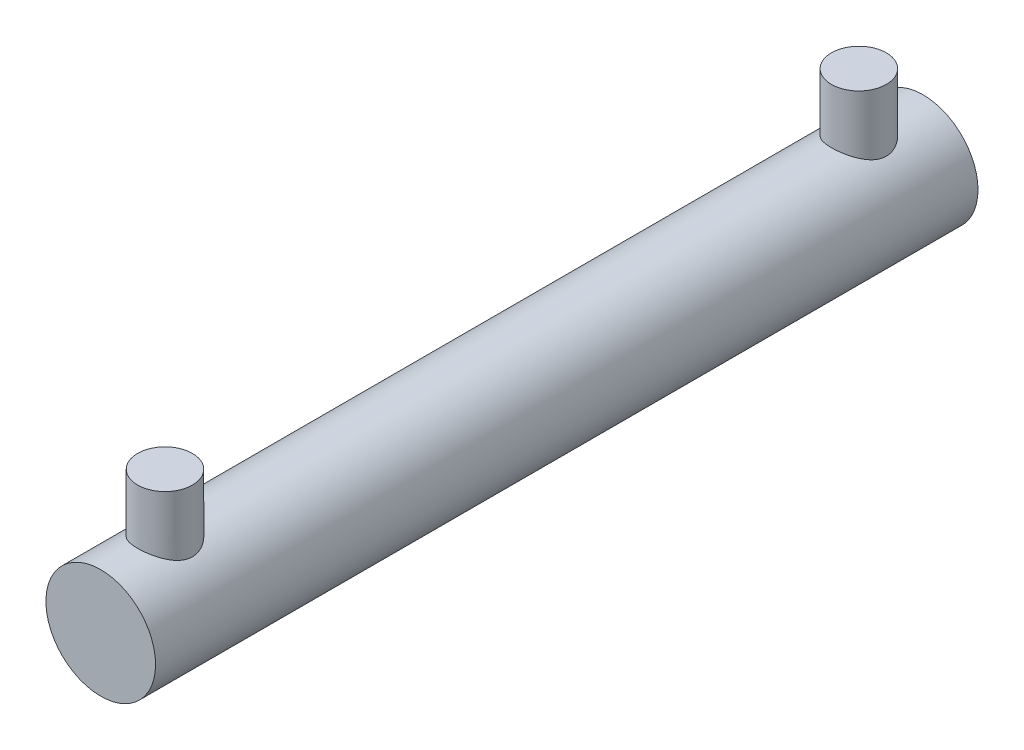
ISO-10303-21;
HEADER;
FILE_DESCRIPTION(('STEP AP214'),'2;1');
FILE_NAME('part.step','',(''),(''),'','','');
FILE_SCHEMA(('AUTOMOTIVE_DESIGN { 1 0 10303 214 1 1 1 1 }'));
ENDSEC;
DATA;
#1=APPLICATION_CONTEXT('core data for automotive mechanical design processes');
#2=APPLICATION_PROTOCOL_DEFINITION('international standard','automotive_design',2000,#1);
#3=PRODUCT_CONTEXT('',#1,'mechanical');
#4=PRODUCT('Part','Part','',(#3));
#5=PRODUCT_RELATED_PRODUCT_CATEGORY('part','',(#4));
#6=PRODUCT_DEFINITION_FORMATION('','',#4);
#7=PRODUCT_DEFINITION_CONTEXT('part definition',#1,'design');
#8=PRODUCT_DEFINITION('design','',#6,#7);
#9=PRODUCT_DEFINITION_SHAPE('','',#8);
#10=(LENGTH_UNIT() NAMED_UNIT(*) SI_UNIT(.MILLI.,.METRE.));
#11=(NAMED_UNIT(*) PLANE_ANGLE_UNIT() SI_UNIT($,.RADIAN.));
#12=(NAMED_UNIT(*) SI_UNIT($,.STERADIAN.) SOLID_ANGLE_UNIT());
#13=UNCERTAINTY_MEASURE_WITH_UNIT(LENGTH_MEASURE(1.E-05),#10,'distance_accuracy_value','');
#14=(GEOMETRIC_REPRESENTATION_CONTEXT(3) GLOBAL_UNCERTAINTY_ASSIGNED_CONTEXT((#13)) GLOBAL_UNIT_ASSIGNED_CONTEXT((#10,
#11,#12)) REPRESENTATION_CONTEXT('',''));
#15=CARTESIAN_POINT('',(0.,0.,0.));
#16=DIRECTION('',(0.,0.,1.));
#17=DIRECTION('',(1.,0.,0.));
#18=AXIS2_PLACEMENT_3D('',#15,#16,#17);
#19=CARTESIAN_POINT('',(0.,0.,150.));
#20=DIRECTION('',(0.,0.,-1.));
#21=DIRECTION('',(-1.,0.,0.));
#22=AXIS2_PLACEMENT_3D('',#19,#20,#21);
#23=CYLINDRICAL_SURFACE('',#22,20.);
#24=CARTESIAN_POINT('',(0.,0.,150.));
#25=DIRECTION('',(0.,0.,1.));
#26=DIRECTION('',(1.,0.,0.));
#27=AXIS2_PLACEMENT_3D('',#24,#25,#26);
#28=CIRCLE('',#27,20.);
#29=CARTESIAN_POINT('',(20.,0.,150.));
#30=VERTEX_POINT('',#29);
#31=EDGE_CURVE('E47',#30,#30,#28,.T.);
#32=ORIENTED_EDGE('',*,*,#31,.F.);
#33=EDGE_LOOP('',(#32));
#34=FACE_BOUND('',#33,.T.);
#35=CARTESIAN_POINT('',(0.,0.,-150.));
#36=DIRECTION('',(0.,0.,1.));
#37=DIRECTION('',(1.,0.,0.));
#38=AXIS2_PLACEMENT_3D('',#35,#36,#37);
#39=CIRCLE('',#38,20.);
#40=CARTESIAN_POINT('',(20.,0.,-150.));
#41=VERTEX_POINT('',#40);
#42=EDGE_CURVE('E51',#41,#41,#39,.T.);
#43=ORIENTED_EDGE('',*,*,#42,.T.);
#44=EDGE_LOOP('',(#43));
#45=FACE_BOUND('',#44,.T.);
#46=CARTESIAN_POINT('',(0.,20.,-136.551526585557));
#47=CARTESIAN_POINT('',(-0.262977747570469,19.9999992010162,-136.551525716711));
#48=CARTESIAN_POINT('',(-0.525973881907788,19.9948010837,-136.541141071612));
#49=CARTESIAN_POINT('',(-1.0500292311712,19.9741395354228,-136.499720760697));
#50=CARTESIAN_POINT('',(-1.31108755349614,19.9586716387275,-136.468676111024));
#51=CARTESIAN_POINT('',(-1.82963226043826,19.9178362229901,-136.386234675155));
#52=CARTESIAN_POINT('',(-2.08711188872545,19.8924520749392,-136.334803700075));
#53=CARTESIAN_POINT('',(-2.59618182802919,19.8324363448083,-136.212188371427));
#54=CARTESIAN_POINT('',(-2.847772725312,19.7978056875818,-136.141005993406));
#55=CARTESIAN_POINT('',(-3.3424683682257,19.720303023444,-135.979957583385));
#56=CARTESIAN_POINT('',(-3.58560245696296,19.6774637808779,-135.890165718101));
#57=CARTESIAN_POINT('',(-4.06298432085465,19.5844658749963,-135.692582263873));
#58=CARTESIAN_POINT('',(-4.29723190454894,19.5343070540929,-135.584790287385));
#59=CARTESIAN_POINT('',(-4.75551398861711,19.4278257394007,-135.352157349032));
#60=CARTESIAN_POINT('',(-4.97955221985718,19.371505523214,-135.227322682912));
#61=CARTESIAN_POINT('',(-5.41653080360957,19.2538936046229,-134.961439656538));
#62=CARTESIAN_POINT('',(-5.62946673237805,19.1925999450287,-134.820384904026));
#63=CARTESIAN_POINT('',(-6.05571153636931,19.0625536763854,-134.514022022171));
#64=CARTESIAN_POINT('',(-6.26826892607331,18.9935741626949,-134.347764382137));
#65=CARTESIAN_POINT('',(-6.67880739057354,18.8531326273725,-133.999081455242));
#66=CARTESIAN_POINT('',(-6.8767876309065,18.7816704639663,-133.816655244132));
#67=CARTESIAN_POINT('',(-7.25738906236846,18.6379106306311,-133.436488005887));
#68=CARTESIAN_POINT('',(-7.44000060064987,18.5656124675679,-133.238737501351));
#69=CARTESIAN_POINT('',(-7.7888836174931,18.4219676840917,-132.828924629332));
#70=CARTESIAN_POINT('',(-7.95515202519228,18.3506212446753,-132.616859584735));
#71=CARTESIAN_POINT('',(-8.28271110573771,18.2052535437119,-132.162333386936));
#72=CARTESIAN_POINT('',(-8.44260565220418,18.1314567024133,-131.918791221173));
#73=CARTESIAN_POINT('',(-8.74109142208521,17.9894590508883,-131.417568105724));
#74=CARTESIAN_POINT('',(-8.87969167215243,17.9212558752544,-131.15989321011));
#75=CARTESIAN_POINT('',(-9.13438777848808,17.7927881626278,-130.631827382426));
#76=CARTESIAN_POINT('',(-9.25049044721744,17.7325212242509,-130.361440330618));
#77=CARTESIAN_POINT('',(-9.45894522420919,17.6222099564148,-129.809640632107));
#78=CARTESIAN_POINT('',(-9.55129996419766,17.5721644943465,-129.528229211101));
#79=CARTESIAN_POINT('',(-9.70625458779874,17.4870229092242,-128.973611545497));
#80=CARTESIAN_POINT('',(-9.77030307761469,17.4512120054423,-128.700920330777));
#81=CARTESIAN_POINT('',(-9.87543221046261,17.3919377517219,-128.149810120021));
#82=CARTESIAN_POINT('',(-9.91651383598184,17.368473873599,-127.871391369529));
#83=CARTESIAN_POINT('',(-9.97504777353869,17.3349233192211,-127.31151198637));
#84=CARTESIAN_POINT('',(-9.99252007209236,17.3248253281998,-127.03005413021));
#85=CARTESIAN_POINT('',(-10.0036080043825,17.3184259915651,-126.46652407572));
#86=CARTESIAN_POINT('',(-9.99722591425208,17.3221233296318,-126.18445193857));
#87=CARTESIAN_POINT('',(-9.96291632672931,17.3418743842694,-125.656121787653));
#88=CARTESIAN_POINT('',(-9.93766509151721,17.3563927185974,-125.409626414199));
#89=CARTESIAN_POINT('',(-9.8690882825972,17.3954780340008,-124.919887361261));
#90=CARTESIAN_POINT('',(-9.82575672853391,17.4200483398744,-124.676644785192));
#91=CARTESIAN_POINT('',(-9.72152759312325,17.4784283554102,-124.195134860528));
#92=CARTESIAN_POINT('',(-9.66063238238804,17.5122368181421,-123.956866845153));
#93=CARTESIAN_POINT('',(-9.5218798945916,17.5880654989193,-123.486573021322));
#94=CARTESIAN_POINT('',(-9.44401584795466,17.6300889935922,-123.254549745775));
#95=CARTESIAN_POINT('',(-9.27007793534025,17.7221768246774,-122.792815994029));
#96=CARTESIAN_POINT('',(-9.17362860412847,17.7724029635355,-122.56327953229));
#97=CARTESIAN_POINT('',(-8.96447979140212,17.878810533816,-122.11308841606));
#98=CARTESIAN_POINT('',(-8.85177491107831,17.9349939421242,-121.892436743663));
#99=CARTESIAN_POINT('',(-8.61087933619458,18.0518884826287,-121.460964810941));
#100=CARTESIAN_POINT('',(-8.48268586368169,18.1126004262899,-121.250146323672));
#101=CARTESIAN_POINT('',(-8.21155546672611,18.2371218065418,-120.839174219348));
#102=CARTESIAN_POINT('',(-8.06861764351119,18.3009314318325,-120.639021253562));
#103=CARTESIAN_POINT('',(-7.74962298190964,18.4384710076206,-120.225394905574));
#104=CARTESIAN_POINT('',(-7.57166567582239,18.5124312542501,-120.013460482218));
#105=CARTESIAN_POINT('',(-7.19890817206694,18.6605447929763,-119.605151721394));
#106=CARTESIAN_POINT('',(-7.00411219662652,18.7346980321841,-119.408773506802));
#107=CARTESIAN_POINT('',(-6.59841324594339,18.8814062531242,-119.032380004797));
#108=CARTESIAN_POINT('',(-6.38749704374534,18.9539598580541,-118.8523784258));
#109=CARTESIAN_POINT('',(-5.95079617043248,19.0955673475655,-118.510073722054));
#110=CARTESIAN_POINT('',(-5.7250174107728,19.164622604476,-118.347763628077));
#111=CARTESIAN_POINT('',(-5.24872768197161,19.3006480329725,-118.034730720068));
#112=CARTESIAN_POINT('',(-4.9975537482717,19.3673693587667,-117.884905739585));
#113=CARTESIAN_POINT('',(-4.48152997851448,19.4932401539485,-117.607157348626));
#114=CARTESIAN_POINT('',(-4.2166795063401,19.5523892706948,-117.479234958071));
#115=CARTESIAN_POINT('',(-3.67526022803787,19.6613492326779,-117.246732282094));
#116=CARTESIAN_POINT('',(-3.39869900661395,19.7111660121174,-117.142137155324));
#117=CARTESIAN_POINT('',(-2.83582264507485,19.7999810198758,-116.957475806685));
#118=CARTESIAN_POINT('',(-2.54950863124166,19.8389804926862,-116.877406763068));
#119=CARTESIAN_POINT('',(-1.9936008207671,19.9021913169255,-116.748460724398));
#120=CARTESIAN_POINT('',(-1.72458658463507,19.9273600412885,-116.697549342596));
#121=CARTESIAN_POINT('',(-1.18250594424723,19.9668602547768,-116.617911427464));
#122=CARTESIAN_POINT('',(-0.909439761223912,19.9811923333691,-116.589183687437));
#123=CARTESIAN_POINT('',(-0.36162145206137,19.9986076087938,-116.554300264774));
#124=CARTESIAN_POINT('',(-0.0868700440476367,20.0016953032259,-116.548135557229));
#125=CARTESIAN_POINT('',(0.462095284936308,19.996544733302,-116.558437773187));
#126=CARTESIAN_POINT('',(0.736309229155645,19.9883069701865,-116.574903695106));
#127=CARTESIAN_POINT('',(1.26069578442055,19.9618171280824,-116.628088647255));
#128=CARTESIAN_POINT('',(1.51108216427542,19.9443921243345,-116.663136158377));
#129=CARTESIAN_POINT('',(2.00770334634759,19.9005341339856,-116.751896580736));
#130=CARTESIAN_POINT('',(2.25393841461836,19.8741017269811,-116.805608290997));
#131=CARTESIAN_POINT('',(2.7406844611906,19.812845023159,-116.931140577652));
#132=CARTESIAN_POINT('',(2.98119512032807,19.7780202596251,-117.002962161184));
#133=CARTESIAN_POINT('',(3.4550508210735,19.7007681992834,-117.16402124393));
#134=CARTESIAN_POINT('',(3.68839556112771,19.6583405830473,-117.253259474905));
#135=CARTESIAN_POINT('',(4.15316088617015,19.5655046555384,-117.451151309876));
#136=CARTESIAN_POINT('',(4.38433936906094,19.5149041886911,-117.560283624391));
#137=CARTESIAN_POINT('',(4.83663774643759,19.4077573479828,-117.79527448192));
#138=CARTESIAN_POINT('',(5.05775400766403,19.3512088504371,-117.921139003261));
#139=CARTESIAN_POINT('',(5.70436813169988,19.1744474473865,-118.322470072004));
#140=CARTESIAN_POINT('',(6.1133785844896,19.0470672570173,-118.621780253218));
#141=CARTESIAN_POINT('',(6.91779518371266,18.7707873202954,-119.309227127247));
#142=CARTESIAN_POINT('',(7.30792110762596,18.6210027147805,-119.703200293549));
#143=CARTESIAN_POINT('',(7.84082560671493,18.3999640224111,-120.338787144147));
#144=CARTESIAN_POINT('',(8.00984942409513,18.3268393772916,-120.558261799021));
#145=CARTESIAN_POINT('',(8.32960568094729,18.183737266458,-121.011266028321));
#146=CARTESIAN_POINT('',(8.4803354830786,18.1137602554328,-121.244797622011));
#147=CARTESIAN_POINT('',(8.76928163027867,17.9757225676596,-121.7364525794));
#148=CARTESIAN_POINT('',(8.90652817819507,17.9079221139821,-121.995219892309));
#149=CARTESIAN_POINT('',(9.15837639012035,17.7804404562871,-122.525338130109));
#150=CARTESIAN_POINT('',(9.27298894306127,17.7207553524022,-122.79668292617));
#151=CARTESIAN_POINT('',(9.47827705930681,17.6118078617936,-123.350076448856));
#152=CARTESIAN_POINT('',(9.56897185129601,17.5625371088176,-123.63211636718));
#153=CARTESIAN_POINT('',(9.72530086409336,17.4764560330943,-124.204909800908));
#154=CARTESIAN_POINT('',(9.79093896514153,17.4396437811433,-124.495661959623));
#155=CARTESIAN_POINT('',(9.89107565144743,17.3830260812378,-125.055051382276));
#156=CARTESIAN_POINT('',(9.92795857968717,17.3619273114046,-125.323132340229));
#157=CARTESIAN_POINT('',(9.97987692141646,17.332136815937,-125.862087244858));
#158=CARTESIAN_POINT('',(9.99491382071395,17.3234442465237,-126.132961000324));
#159=CARTESIAN_POINT('',(10.0029096686844,17.3188284226879,-126.675040154455));
#160=CARTESIAN_POINT('',(9.9958767833924,17.3229004452416,-126.946245393347));
#161=CARTESIAN_POINT('',(9.95985898725887,17.3436339919872,-127.486698695321));
#162=CARTESIAN_POINT('',(9.93087497508662,17.3602950007916,-127.75594683807));
#163=CARTESIAN_POINT('',(9.85519722920277,17.4033551463061,-128.26464103095));
#164=CARTESIAN_POINT('',(9.81046230963215,17.4286705637748,-128.504474594482));
#165=CARTESIAN_POINT('',(9.70388285528389,17.4882355534742,-128.979255783384));
#166=CARTESIAN_POINT('',(9.64203265928581,17.5224880816187,-129.214201764393));
#167=CARTESIAN_POINT('',(9.50186064219783,17.5988921487312,-129.67775020196));
#168=CARTESIAN_POINT('',(9.42354151869526,17.6410423939411,-129.906353690475));
#169=CARTESIAN_POINT('',(9.25107208633865,17.7320944008379,-130.356225073901));
#170=CARTESIAN_POINT('',(9.15691467555994,17.7809991895098,-130.577489624492));
#171=CARTESIAN_POINT('',(8.94668289722952,17.8877520145129,-131.02615247768));
#172=CARTESIAN_POINT('',(8.82956366921283,17.9459794825375,-131.252970764157));
#173=CARTESIAN_POINT('',(8.57895403368728,18.067122458149,-131.696072016429));
#174=CARTESIAN_POINT('',(8.44546216273868,18.130038384608,-131.912354038041));
#175=CARTESIAN_POINT('',(8.16285657798004,18.2590224525038,-132.333577962916));
#176=CARTESIAN_POINT('',(8.01373739051541,18.3250916939848,-132.538515854095));
#177=CARTESIAN_POINT('',(7.70065351710478,18.4588439084551,-132.936195185127));
#178=CARTESIAN_POINT('',(7.53668670721057,18.5265271112979,-133.12893487331));
#179=CARTESIAN_POINT('',(7.17380336462424,18.6702735648096,-133.524115656427));
#180=CARTESIAN_POINT('',(6.97306234663123,18.746353564782,-133.724879760119));
#181=CARTESIAN_POINT('',(6.55492133587247,18.8966226391637,-134.108877993293));
#182=CARTESIAN_POINT('',(6.33752607360946,18.9708122426046,-134.292117067611));
#183=CARTESIAN_POINT('',(5.88693376044407,19.1154396310611,-134.640104805661));
#184=CARTESIAN_POINT('',(5.65372458790795,19.1858744624017,-134.8048390222));
#185=CARTESIAN_POINT('',(5.17289544211031,19.3210638569054,-135.114405713197));
#186=CARTESIAN_POINT('',(4.9252763003718,19.3858187472881,-135.259239334397));
#187=CARTESIAN_POINT('',(4.41518835199795,19.5083417849818,-135.528714863554));
#188=CARTESIAN_POINT('',(4.15262447046933,19.5660555714726,-135.653201915895));
#189=CARTESIAN_POINT('',(3.61607511779453,19.6722841833782,-135.879373948781));
#190=CARTESIAN_POINT('',(3.34209105214396,19.7208001367275,-135.981061725492));
#191=CARTESIAN_POINT('',(2.78539452130532,19.8070877528213,-136.160214078864));
#192=CARTESIAN_POINT('',(2.50270444198693,19.8448847753657,-136.237735873452));
#193=CARTESIAN_POINT('',(1.93047321727417,19.908692874149,-136.367802675625));
#194=CARTESIAN_POINT('',(1.64093637072212,19.9347111494098,-136.420362940349));
#195=CARTESIAN_POINT('',(1.12608352412094,19.9695276660452,-136.490475489065));
#196=CARTESIAN_POINT('',(0.90165168027671,19.9809348086311,-136.513350051871));
#197=CARTESIAN_POINT('',(0.451484431282411,19.9961714231232,-136.543876183128));
#198=CARTESIAN_POINT('',(0.225748990324603,20.0000006858747,-136.551527331403));
#199=CARTESIAN_POINT('',(0.,20.,-136.551526585557));
#200=B_SPLINE_CURVE_WITH_KNOTS('',3,(#46,#47,#48,#49,#50,#51,#52,#53,#54,#55,#56,#57,#58,#59,
#60,#61,#62,#63,#64,#65,#66,#67,#68,#69,#70,#71,#72,#73,#74,#75,#76,#77,#78,#79,#80,#81,#82,#83,
#84,#85,#86,#87,#88,#89,#90,#91,#92,#93,#94,#95,#96,#97,#98,#99,#100,#101,#102,#103,#104,#105,
#106,#107,#108,#109,#110,#111,#112,#113,#114,#115,#116,#117,#118,#119,#120,#121,#122,#123,#124,
#125,#126,#127,#128,#129,#130,#131,#132,#133,#134,#135,#136,#137,#138,#139,#140,#141,#142,#143,
#144,#145,#146,#147,#148,#149,#150,#151,#152,#153,#154,#155,#156,#157,#158,#159,#160,#161,#162,
#163,#164,#165,#166,#167,#168,#169,#170,#171,#172,#173,#174,#175,#176,#177,#178,#179,#180,#181,
#182,#183,#184,#185,#186,#187,#188,#189,#190,#191,#192,#193,#194,#195,#196,#197,#198,#199),
.UNSPECIFIED.,.T.,.F.,(4,2,2,2,2,2,2,2,2,2,2,2,2,2,2,2,2,2,2,2,2,2,2,2,2,2,2,2,2,2,2,2,2,2,2,2,
2,2,2,2,2,2,2,2,2,2,2,2,2,2,2,2,2,2,2,2,2,2,2,2,2,2,2,2,2,2,2,2,2,2,2,2,2,2,2,2,4),(0.,
0.788710589250996,1.57776436803951,2.36814706638947,3.15845073874465,3.94566328103175,
4.73289277422683,5.51983223968627,6.3070829040182,7.14179607204602,7.97655698581612,
8.81183834708135,9.64727635829489,10.5477781072243,11.447897073936,12.3477430494905,
13.2474892618302,14.0934532489038,14.9393810441651,15.7845922682139,16.6297228461314,
17.3734776288847,18.1174786157194,18.8613792297722,19.6055771618311,20.3667813084855,
21.1282388516736,21.889833169209,22.6514739387577,23.509891476961,24.3680943913846,
25.2270091977564,26.0855844184835,26.9843425878092,27.8831425974923,28.7813691279581,
29.679492277851,30.5032194900487,31.3269018918016,32.1502547956571,32.9735712608452,
33.7329722323226,34.4923243480979,35.2517187027837,36.0111449703724,36.7921013676949,
37.5733375502822,39.1349970223263,40.8500130119071,41.7087612506847,42.5676331434658,
43.4684238669888,44.3687801699595,45.2684104094407,46.1679012770191,46.9810473193187,
47.7941380547514,48.606927974181,49.4196846201563,50.1547113408423,50.889981477547,
51.6251312717133,52.3606115917998,53.1452977478639,53.9300540928963,54.7150862327853,
55.5002308492403,56.3809909668478,57.2615018327172,58.1426954259119,59.0238382204153,
59.9114030040692,60.7988588747469,61.6841972652664,62.5689938151569,63.2460309664337,
63.9230868041488),.UNSPECIFIED.);
#201=CARTESIAN_POINT('',(0.,20.,-136.551526585557));
#202=VERTEX_POINT('',#201);
#203=EDGE_CURVE('E43',#202,#202,#200,.T.);
#204=ORIENTED_EDGE('',*,*,#203,.F.);
#205=EDGE_LOOP('',(#204));
#206=FACE_BOUND('',#205,.T.);
#207=CARTESIAN_POINT('',(0.,20.,116.551526585557));
#208=CARTESIAN_POINT('',(-0.262977747570471,19.9999992010162,116.551527454403));
#209=CARTESIAN_POINT('',(-0.525973881907791,19.9948010837,116.561912099501));
#210=CARTESIAN_POINT('',(-1.05002923117121,19.9741395354228,116.603332410416));
#211=CARTESIAN_POINT('',(-1.31108755349614,19.9586716387275,116.63437706009));
#212=CARTESIAN_POINT('',(-1.82963226043827,19.9178362229901,116.716818495958));
#213=CARTESIAN_POINT('',(-2.08711188872545,19.8924520749392,116.768249471039));
#214=CARTESIAN_POINT('',(-2.59618182802919,19.8324363448083,116.890864799686));
#215=CARTESIAN_POINT('',(-2.84777272531199,19.7978056875818,116.962047177708));
#216=CARTESIAN_POINT('',(-3.34246836822569,19.720303023444,117.123095587729));
#217=CARTESIAN_POINT('',(-3.58560245696294,19.6774637808779,117.212887453012));
#218=CARTESIAN_POINT('',(-4.06298432085464,19.5844658749963,117.410470907241));
#219=CARTESIAN_POINT('',(-4.29723190454893,19.5343070540929,117.518262883729));
#220=CARTESIAN_POINT('',(-4.75551398861711,19.4278257394007,117.750895822082));
#221=CARTESIAN_POINT('',(-4.97955221985717,19.371505523214,117.875730488202));
#222=CARTESIAN_POINT('',(-5.41653080360956,19.2538936046229,118.141613514575));
#223=CARTESIAN_POINT('',(-5.62946673237804,19.1925999450287,118.282668267088));
#224=CARTESIAN_POINT('',(-6.0557115363693,19.0625536763854,118.589031148943));
#225=CARTESIAN_POINT('',(-6.26826892607329,18.9935741626949,118.755288788976));
#226=CARTESIAN_POINT('',(-6.67880739057352,18.8531326273725,119.103971715872));
#227=CARTESIAN_POINT('',(-6.87678763090649,18.7816704639663,119.286397926982));
#228=CARTESIAN_POINT('',(-7.25738906236845,18.6379106306311,119.666565165227));
#229=CARTESIAN_POINT('',(-7.44000060064985,18.5656124675679,119.864315669763));
#230=CARTESIAN_POINT('',(-7.78888361749308,18.4219676840917,120.274128541782));
#231=CARTESIAN_POINT('',(-7.95515202519226,18.3506212446753,120.486193586378));
#232=CARTESIAN_POINT('',(-8.28271110573769,18.2052535437119,120.940719784177));
#233=CARTESIAN_POINT('',(-8.44260565220416,18.1314567024133,121.184261949941));
#234=CARTESIAN_POINT('',(-8.74109142208519,17.9894590508883,121.68548506539));
#235=CARTESIAN_POINT('',(-8.87969167215241,17.9212558752544,121.943159961003));
#236=CARTESIAN_POINT('',(-9.13438777848808,17.7927881626278,122.471225788688));
#237=CARTESIAN_POINT('',(-9.25049044721743,17.7325212242509,122.741612840496));
#238=CARTESIAN_POINT('',(-9.45894522420918,17.6222099564149,123.293412539007));
#239=CARTESIAN_POINT('',(-9.55129996419766,17.5721644943465,123.574823960013));
#240=CARTESIAN_POINT('',(-9.70625458779874,17.4870229092242,124.129441625616));
#241=CARTESIAN_POINT('',(-9.77030307761468,17.4512120054423,124.402132840337));
#242=CARTESIAN_POINT('',(-9.8754322104626,17.3919377517219,124.953243051093));
#243=CARTESIAN_POINT('',(-9.91651383598183,17.368473873599,125.231661801584));
#244=CARTESIAN_POINT('',(-9.97504777353869,17.3349233192211,125.791541184743));
#245=CARTESIAN_POINT('',(-9.99252007209236,17.3248253281998,126.072999040904));
#246=CARTESIAN_POINT('',(-10.0036080043825,17.3184259915651,126.636529095394));
#247=CARTESIAN_POINT('',(-9.99722591425207,17.3221233296318,126.918601232543));
#248=CARTESIAN_POINT('',(-9.96291632672931,17.3418743842694,127.44693138346));
#249=CARTESIAN_POINT('',(-9.93766509151721,17.3563927185974,127.693426756915));
#250=CARTESIAN_POINT('',(-9.8690882825972,17.3954780340008,128.183165809852));
#251=CARTESIAN_POINT('',(-9.82575672853391,17.4200483398744,128.426408385921));
#252=CARTESIAN_POINT('',(-9.72152759312324,17.4784283554102,128.907918310586));
#253=CARTESIAN_POINT('',(-9.66063238238804,17.5122368181421,129.14618632596));
#254=CARTESIAN_POINT('',(-9.52187989459161,17.5880654989193,129.616480149792));
#255=CARTESIAN_POINT('',(-9.44401584795466,17.6300889935922,129.848503425339));
#256=CARTESIAN_POINT('',(-9.27007793534026,17.7221768246774,130.310237177085));
#257=CARTESIAN_POINT('',(-9.17362860412847,17.7724029635355,130.539773638824));
#258=CARTESIAN_POINT('',(-8.96447979140212,17.878810533816,130.989964755054));
#259=CARTESIAN_POINT('',(-8.85177491107832,17.9349939421242,131.210616427451));
#260=CARTESIAN_POINT('',(-8.61087933619459,18.0518884826287,131.642088360173));
#261=CARTESIAN_POINT('',(-8.4826858636817,18.1126004262899,131.852906847442));
#262=CARTESIAN_POINT('',(-8.21155546672612,18.2371218065418,132.263878951766));
#263=CARTESIAN_POINT('',(-8.0686176435112,18.3009314318325,132.464031917552));
#264=CARTESIAN_POINT('',(-7.74962298190964,18.4384710076206,132.87765826554));
#265=CARTESIAN_POINT('',(-7.5716656758224,18.5124312542501,133.089592688896));
#266=CARTESIAN_POINT('',(-7.19890817206695,18.6605447929763,133.497901449719));
#267=CARTESIAN_POINT('',(-7.00411219662655,18.7346980321841,133.694279664312));
#268=CARTESIAN_POINT('',(-6.59841324594341,18.8814062531242,134.070673166317));
#269=CARTESIAN_POINT('',(-6.38749704374536,18.9539598580541,134.250674745314));
#270=CARTESIAN_POINT('',(-5.9507961704325,19.0955673475654,134.59297944906));
#271=CARTESIAN_POINT('',(-5.72501741077281,19.164622604476,134.755289543037));
#272=CARTESIAN_POINT('',(-5.24872768197161,19.3006480329725,135.068322451046));
#273=CARTESIAN_POINT('',(-4.99755374827169,19.3673693587667,135.218147431529));
#274=CARTESIAN_POINT('',(-4.48152997851447,19.4932401539485,135.495895822487));
#275=CARTESIAN_POINT('',(-4.2166795063401,19.5523892706948,135.623818213043));
#276=CARTESIAN_POINT('',(-3.67526022803787,19.6613492326779,135.85632088902));
#277=CARTESIAN_POINT('',(-3.39869900661395,19.7111660121174,135.96091601579));
#278=CARTESIAN_POINT('',(-2.83582264507486,19.7999810198758,136.145577364429));
#279=CARTESIAN_POINT('',(-2.54950863124167,19.8389804926862,136.225646408045));
#280=CARTESIAN_POINT('',(-1.9936008207671,19.9021913169255,136.354592446716));
#281=CARTESIAN_POINT('',(-1.72458658463507,19.9273600412885,136.405503828518));
#282=CARTESIAN_POINT('',(-1.18250594424724,19.9668602547768,136.48514174365));
#283=CARTESIAN_POINT('',(-0.909439761223918,19.9811923333691,136.513869483677));
#284=CARTESIAN_POINT('',(-0.361621452061378,19.9986076087938,136.54875290634));
#285=CARTESIAN_POINT('',(-0.0868700440476455,20.0016953032259,136.554917613885));
#286=CARTESIAN_POINT('',(0.4620952849363,19.996544733302,136.544615397927));
#287=CARTESIAN_POINT('',(0.736309229155638,19.9883069701865,136.528149476008));
#288=CARTESIAN_POINT('',(1.26069578442055,19.9618171280824,136.474964523859));
#289=CARTESIAN_POINT('',(1.51108216427542,19.9443921243345,136.439917012736));
#290=CARTESIAN_POINT('',(2.0077033463476,19.9005341339856,136.351156590378));
#291=CARTESIAN_POINT('',(2.25393841461836,19.8741017269811,136.297444880116));
#292=CARTESIAN_POINT('',(2.7406844611906,19.812845023159,136.171912593461));
#293=CARTESIAN_POINT('',(2.98119512032807,19.7780202596251,136.100091009929));
#294=CARTESIAN_POINT('',(3.45505082107349,19.7007681992834,135.939031927184));
#295=CARTESIAN_POINT('',(3.68839556112771,19.6583405830473,135.849793696209));
#296=CARTESIAN_POINT('',(4.15316088617015,19.5655046555384,135.651901861237));
#297=CARTESIAN_POINT('',(4.38433936906094,19.5149041886911,135.542769546723));
#298=CARTESIAN_POINT('',(4.83663774643759,19.4077573479828,135.307778689194));
#299=CARTESIAN_POINT('',(5.05775400766404,19.3512088504371,135.181914167852));
#300=CARTESIAN_POINT('',(5.70436813169988,19.1744474473865,134.78058309911));
#301=CARTESIAN_POINT('',(6.1133785844896,19.0470672570173,134.481272917896));
#302=CARTESIAN_POINT('',(6.91779518371265,18.7707873202954,133.793826043867));
#303=CARTESIAN_POINT('',(7.30792110762595,18.6210027147805,133.399852877565));
#304=CARTESIAN_POINT('',(7.84082560671493,18.3999640224111,132.764266026967));
#305=CARTESIAN_POINT('',(8.00984942409512,18.3268393772916,132.544791372093));
#306=CARTESIAN_POINT('',(8.32960568094728,18.183737266458,132.091787142793));
#307=CARTESIAN_POINT('',(8.4803354830786,18.1137602554328,131.858255549103));
#308=CARTESIAN_POINT('',(8.76928163027866,17.9757225676596,131.366600591714));
#309=CARTESIAN_POINT('',(8.90652817819506,17.9079221139821,131.107833278805));
#310=CARTESIAN_POINT('',(9.15837639012035,17.7804404562871,130.577715041005));
#311=CARTESIAN_POINT('',(9.27298894306128,17.7207553524022,130.306370244943));
#312=CARTESIAN_POINT('',(9.47827705930681,17.6118078617936,129.752976722258));
#313=CARTESIAN_POINT('',(9.568971851296,17.5625371088176,129.470936803934));
#314=CARTESIAN_POINT('',(9.72530086409336,17.4764560330943,128.898143370205));
#315=CARTESIAN_POINT('',(9.79093896514153,17.4396437811433,128.607391211491));
#316=CARTESIAN_POINT('',(9.89107565144743,17.3830260812378,128.048001788838));
#317=CARTESIAN_POINT('',(9.92795857968716,17.3619273114046,127.779920830884));
#318=CARTESIAN_POINT('',(9.97987692141645,17.332136815937,127.240965926256));
#319=CARTESIAN_POINT('',(9.99491382071395,17.3234442465237,126.97009217079));
#320=CARTESIAN_POINT('',(10.0029096686844,17.3188284226879,126.428013016659));
#321=CARTESIAN_POINT('',(9.9958767833924,17.3229004452416,126.156807777767));
#322=CARTESIAN_POINT('',(9.95985898725887,17.3436339919872,125.616354475793));
#323=CARTESIAN_POINT('',(9.93087497508661,17.3602950007916,125.347106333044));
#324=CARTESIAN_POINT('',(9.85519722920276,17.4033551463061,124.838412140164));
#325=CARTESIAN_POINT('',(9.81046230963215,17.4286705637748,124.598578576632));
#326=CARTESIAN_POINT('',(9.70388285528388,17.4882355534742,124.12379738773));
#327=CARTESIAN_POINT('',(9.6420326592858,17.5224880816187,123.88885140672));
#328=CARTESIAN_POINT('',(9.50186064219781,17.5988921487312,123.425302969154));
#329=CARTESIAN_POINT('',(9.42354151869525,17.6410423939411,123.196699480639));
#330=CARTESIAN_POINT('',(9.25107208633864,17.7320944008379,122.746828097213));
#331=CARTESIAN_POINT('',(9.15691467555994,17.7809991895098,122.525563546621));
#332=CARTESIAN_POINT('',(8.94668289722952,17.8877520145129,122.076900693434));
#333=CARTESIAN_POINT('',(8.82956366921284,17.9459794825375,121.850082406957));
#334=CARTESIAN_POINT('',(8.57895403368727,18.067122458149,121.406981154685));
#335=CARTESIAN_POINT('',(8.44546216273868,18.130038384608,121.190699133073));
#336=CARTESIAN_POINT('',(8.16285657798003,18.2590224525038,120.769475208197));
#337=CARTESIAN_POINT('',(8.0137373905154,18.3250916939848,120.564537317019));
#338=CARTESIAN_POINT('',(7.70065351710477,18.4588439084551,120.166857985987));
#339=CARTESIAN_POINT('',(7.53668670721056,18.5265271112979,119.974118297804));
#340=CARTESIAN_POINT('',(7.17380336462423,18.6702735648096,119.578937514687));
#341=CARTESIAN_POINT('',(6.97306234663122,18.746353564782,119.378173410995));
#342=CARTESIAN_POINT('',(6.55492133587247,18.8966226391637,118.994175177821));
#343=CARTESIAN_POINT('',(6.33752607360945,18.9708122426046,118.810936103502));
#344=CARTESIAN_POINT('',(5.88693376044406,19.1154396310611,118.462948365453));
#345=CARTESIAN_POINT('',(5.65372458790795,19.1858744624017,118.298214148914));
#346=CARTESIAN_POINT('',(5.17289544211031,19.3210638569054,117.988647457916));
#347=CARTESIAN_POINT('',(4.92527630037179,19.3858187472881,117.843813836717));
#348=CARTESIAN_POINT('',(4.41518835199793,19.5083417849818,117.57433830756));
#349=CARTESIAN_POINT('',(4.15262447046931,19.5660555714726,117.449851255219));
#350=CARTESIAN_POINT('',(3.61607511779452,19.6722841833782,117.223679222332));
#351=CARTESIAN_POINT('',(3.34209105214394,19.7208001367275,117.121991445622));
#352=CARTESIAN_POINT('',(2.78539452130531,19.8070877528213,116.94283909225));
#353=CARTESIAN_POINT('',(2.50270444198692,19.8448847753657,116.865317297662));
#354=CARTESIAN_POINT('',(1.93047321727416,19.908692874149,116.735250495488));
#355=CARTESIAN_POINT('',(1.64093637072211,19.9347111494098,116.682690230765));
#356=CARTESIAN_POINT('',(1.12608352412093,19.9695276660452,116.612577682048));
#357=CARTESIAN_POINT('',(0.901651680276707,19.9809348086311,116.589703119243));
#358=CARTESIAN_POINT('',(0.451484431282411,19.9961714231232,116.559176987985));
#359=CARTESIAN_POINT('',(0.225748990324603,20.0000006858747,116.55152583971));
#360=CARTESIAN_POINT('',(0.,20.,116.551526585557));
#361=B_SPLINE_CURVE_WITH_KNOTS('',3,(#207,#208,#209,#210,#211,#212,#213,#214,#215,#216,#217,
#218,#219,#220,#221,#222,#223,#224,#225,#226,#227,#228,#229,#230,#231,#232,#233,#234,#235,#236,
#237,#238,#239,#240,#241,#242,#243,#244,#245,#246,#247,#248,#249,#250,#251,#252,#253,#254,#255,
#256,#257,#258,#259,#260,#261,#262,#263,#264,#265,#266,#267,#268,#269,#270,#271,#272,#273,#274,
#275,#276,#277,#278,#279,#280,#281,#282,#283,#284,#285,#286,#287,#288,#289,#290,#291,#292,#293,
#294,#295,#296,#297,#298,#299,#300,#301,#302,#303,#304,#305,#306,#307,#308,#309,#310,#311,#312,
#313,#314,#315,#316,#317,#318,#319,#320,#321,#322,#323,#324,#325,#326,#327,#328,#329,#330,#331,
#332,#333,#334,#335,#336,#337,#338,#339,#340,#341,#342,#343,#344,#345,#346,#347,#348,#349,#350,
#351,#352,#353,#354,#355,#356,#357,#358,#359,#360),.UNSPECIFIED.,.T.,.F.,(4,2,2,2,2,2,2,2,2,2,2,
2,2,2,2,2,2,2,2,2,2,2,2,2,2,2,2,2,2,2,2,2,2,2,2,2,2,2,2,2,2,2,2,2,2,2,2,2,2,2,2,2,2,2,2,2,2,2,2,
2,2,2,2,2,2,2,2,2,2,2,2,2,2,2,2,2,4),(0.,0.788710589251,1.57776436803952,2.36814706638946,
3.15845073874465,3.94566328103173,4.73289277422682,5.51983223968625,6.30708290401818,
7.14179607204601,7.97655698581609,8.81183834708132,9.64727635829488,10.5477781072242,
11.447897073936,12.3477430494904,13.2474892618302,14.0934532489038,14.9393810441651,
15.7845922682139,16.6297228461314,17.3734776288846,18.1174786157194,18.8613792297722,
19.6055771618311,20.3667813084854,21.1282388516736,21.889833169209,22.6514739387577,
23.5098914769609,24.3680943913845,25.2270091977564,26.0855844184835,26.9843425878092,
27.8831425974923,28.781369127958,29.679492277851,30.5032194900487,31.3269018918016,
32.1502547956571,32.9735712608452,33.7329722323226,34.4923243480979,35.2517187027837,
36.0111449703724,36.7921013676949,37.5733375502822,39.1349970223262,40.850013011907,
41.7087612506847,42.5676331434657,43.4684238669888,44.3687801699595,45.2684104094407,
46.1679012770191,46.9810473193187,47.7941380547513,48.6069279741809,49.4196846201562,
50.1547113408423,50.889981477547,51.6251312717133,52.3606115917998,53.1452977478638,
53.9300540928963,54.7150862327853,55.5002308492403,56.3809909668478,57.2615018327172,
58.1426954259119,59.0238382204153,59.9114030040692,60.7988588747469,61.6841972652663,
62.5689938151569,63.2460309664337,63.9230868041487),.UNSPECIFIED.);
#362=CARTESIAN_POINT('',(0.,20.,116.551526585557));
#363=VERTEX_POINT('',#362);
#364=EDGE_CURVE('E10',#363,#363,#361,.T.);
#365=ORIENTED_EDGE('',*,*,#364,.F.);
#366=EDGE_LOOP('',(#365));
#367=FACE_BOUND('',#366,.T.);
#368=ADVANCED_FACE('F33',(#34,#45,#206,#367),#23,.T.);
#369=CARTESIAN_POINT('',(0.,0.,150.));
#370=DIRECTION('',(0.,0.,1.));
#371=DIRECTION('',(1.,0.,0.));
#372=AXIS2_PLACEMENT_3D('',#369,#370,#371);
#373=PLANE('',#372);
#374=ORIENTED_EDGE('',*,*,#31,.T.);
#375=EDGE_LOOP('',(#374));
#376=FACE_BOUND('',#375,.T.);
#377=ADVANCED_FACE('F65',(#376),#373,.T.);
#378=CARTESIAN_POINT('',(0.,0.,-150.));
#379=DIRECTION('',(0.,0.,1.));
#380=DIRECTION('',(1.,0.,0.));
#381=AXIS2_PLACEMENT_3D('',#378,#379,#380);
#382=PLANE('',#381);
#383=ORIENTED_EDGE('',*,*,#42,.F.);
#384=EDGE_LOOP('',(#383));
#385=FACE_BOUND('',#384,.T.);
#386=ADVANCED_FACE('F63',(#385),#382,.F.);
#387=CARTESIAN_POINT('',(0.,40.,-126.551526585557));
#388=DIRECTION('',(0.,-1.,0.));
#389=DIRECTION('',(0.,0.,-1.));
#390=AXIS2_PLACEMENT_3D('',#387,#388,#389);
#391=CYLINDRICAL_SURFACE('',#390,10.);
#392=CARTESIAN_POINT('',(0.,40.,-126.551526585557));
#393=DIRECTION('',(0.,1.,0.));
#394=DIRECTION('',(0.,0.,1.));
#395=AXIS2_PLACEMENT_3D('',#392,#393,#394);
#396=CIRCLE('',#395,10.);
#397=CARTESIAN_POINT('',(0.,40.,-116.551526585557));
#398=VERTEX_POINT('',#397);
#399=EDGE_CURVE('E82',#398,#398,#396,.T.);
#400=ORIENTED_EDGE('',*,*,#399,.F.);
#401=EDGE_LOOP('',(#400));
#402=FACE_BOUND('',#401,.T.);
#403=ORIENTED_EDGE('',*,*,#203,.T.);
#404=EDGE_LOOP('',(#403));
#405=FACE_BOUND('',#404,.T.);
#406=ADVANCED_FACE('F57',(#402,#405),#391,.T.);
#407=CARTESIAN_POINT('',(0.,40.,-126.551526585557));
#408=DIRECTION('',(0.,1.,0.));
#409=DIRECTION('',(0.,0.,1.));
#410=AXIS2_PLACEMENT_3D('',#407,#408,#409);
#411=PLANE('',#410);
#412=ORIENTED_EDGE('',*,*,#399,.T.);
#413=EDGE_LOOP('',(#412));
#414=FACE_BOUND('',#413,.T.);
#415=ADVANCED_FACE('F62',(#414),#411,.T.);
#416=CARTESIAN_POINT('',(0.,40.,126.551526585557));
#417=DIRECTION('',(0.,-1.,0.));
#418=DIRECTION('',(0.,0.,-1.));
#419=AXIS2_PLACEMENT_3D('',#416,#417,#418);
#420=CYLINDRICAL_SURFACE('',#419,10.);
#421=CARTESIAN_POINT('',(0.,40.,126.551526585557));
#422=DIRECTION('',(0.,1.,0.));
#423=DIRECTION('',(0.,0.,-1.));
#424=AXIS2_PLACEMENT_3D('',#421,#422,#423);
#425=CIRCLE('',#424,10.);
#426=CARTESIAN_POINT('',(0.,40.,116.551526585557));
#427=VERTEX_POINT('',#426);
#428=EDGE_CURVE('E84',#427,#427,#425,.T.);
#429=ORIENTED_EDGE('',*,*,#428,.F.);
#430=EDGE_LOOP('',(#429));
#431=FACE_BOUND('',#430,.T.);
#432=ORIENTED_EDGE('',*,*,#364,.T.);
#433=EDGE_LOOP('',(#432));
#434=FACE_BOUND('',#433,.T.);
#435=ADVANCED_FACE('F94',(#431,#434),#420,.T.);
#436=CARTESIAN_POINT('',(0.,40.,126.551526585557));
#437=DIRECTION('',(0.,-1.,0.));
#438=DIRECTION('',(0.,0.,-1.));
#439=AXIS2_PLACEMENT_3D('',#436,#437,#438);
#440=PLANE('',#439);
#441=ORIENTED_EDGE('',*,*,#428,.T.);
#442=EDGE_LOOP('',(#441));
#443=FACE_BOUND('',#442,.T.);
#444=ADVANCED_FACE('F92',(#443),#440,.F.);
#445=CLOSED_SHELL('',(#368,#377,#386,#406,#415,#435,#444));
#446=MANIFOLD_SOLID_BREP('B2',#445);
#447=ADVANCED_BREP_SHAPE_REPRESENTATION('',(#18,#446),#14);
#448=SHAPE_DEFINITION_REPRESENTATION(#9,#447);
ENDSEC;
END-ISO-10303-21;
